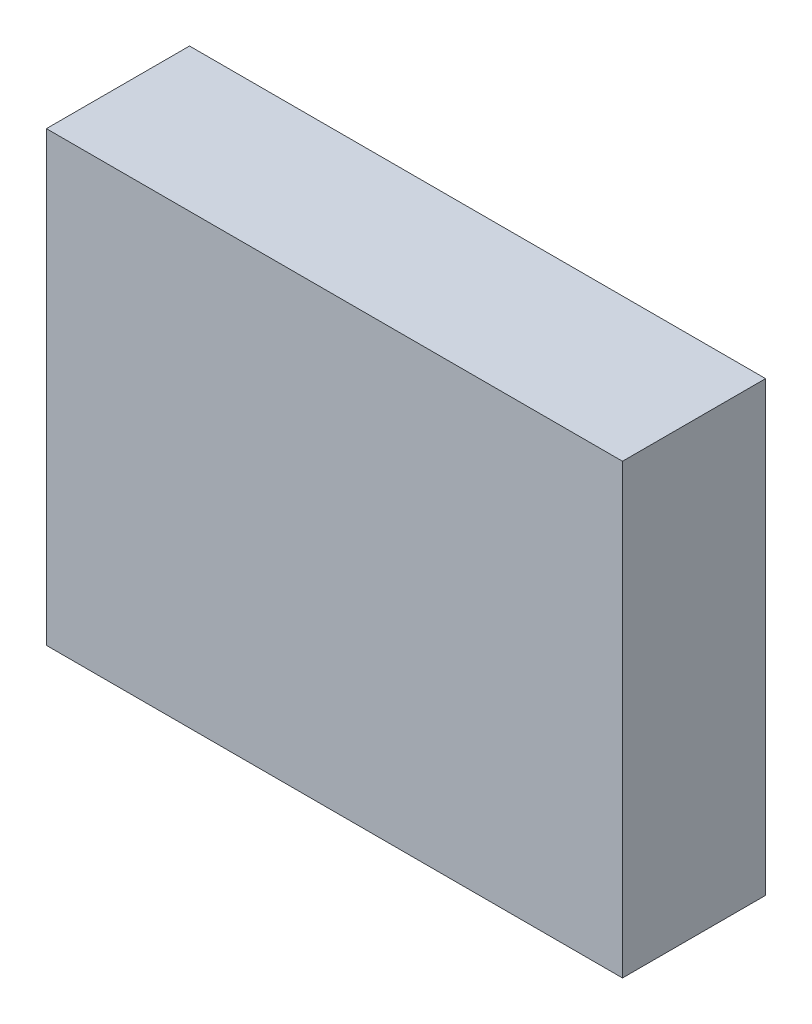
ISO-10303-21;
HEADER;
FILE_DESCRIPTION(('STEP AP214'),'2;1');
FILE_NAME('part.step','',(''),(''),'','','');
FILE_SCHEMA(('AUTOMOTIVE_DESIGN { 1 0 10303 214 1 1 1 1 }'));
ENDSEC;
DATA;
#1=APPLICATION_CONTEXT('core data for automotive mechanical design processes');
#2=APPLICATION_PROTOCOL_DEFINITION('international standard','automotive_design',2000,#1);
#3=PRODUCT_CONTEXT('',#1,'mechanical');
#4=PRODUCT('Part','Part','',(#3));
#5=PRODUCT_RELATED_PRODUCT_CATEGORY('part','',(#4));
#6=PRODUCT_DEFINITION_FORMATION('','',#4);
#7=PRODUCT_DEFINITION_CONTEXT('part definition',#1,'design');
#8=PRODUCT_DEFINITION('design','',#6,#7);
#9=PRODUCT_DEFINITION_SHAPE('','',#8);
#10=(LENGTH_UNIT() NAMED_UNIT(*) SI_UNIT(.MILLI.,.METRE.));
#11=(NAMED_UNIT(*) PLANE_ANGLE_UNIT() SI_UNIT($,.RADIAN.));
#12=(NAMED_UNIT(*) SI_UNIT($,.STERADIAN.) SOLID_ANGLE_UNIT());
#13=UNCERTAINTY_MEASURE_WITH_UNIT(LENGTH_MEASURE(1.E-05),#10,'distance_accuracy_value','');
#14=(GEOMETRIC_REPRESENTATION_CONTEXT(3) GLOBAL_UNCERTAINTY_ASSIGNED_CONTEXT((#13)) GLOBAL_UNIT_ASSIGNED_CONTEXT((#10,
#11,#12)) REPRESENTATION_CONTEXT('',''));
#15=CARTESIAN_POINT('',(0.,0.,0.));
#16=DIRECTION('',(0.,0.,1.));
#17=DIRECTION('',(1.,0.,0.));
#18=AXIS2_PLACEMENT_3D('',#15,#16,#17);
#19=CARTESIAN_POINT('',(1.400045,-0.99987,1.));
#20=DIRECTION('',(0.,0.,1.));
#21=DIRECTION('',(1.,0.,0.));
#22=AXIS2_PLACEMENT_3D('',#19,#20,#21);
#23=PLANE('',#22);
#24=DIRECTION('',(1.,0.,0.));
#25=VECTOR('',#24,1.);
#26=CARTESIAN_POINT('',(-0.61265,-2.56337,1.));
#27=LINE('',#26,#25);
#28=CARTESIAN_POINT('',(-0.61265,-2.56337,1.));
#29=VERTEX_POINT('',#28);
#30=CARTESIAN_POINT('',(3.41274,-2.56337,1.));
#31=VERTEX_POINT('',#30);
#32=EDGE_CURVE('E90',#29,#31,#27,.T.);
#33=ORIENTED_EDGE('',*,*,#32,.T.);
#34=DIRECTION('',(0.,1.,0.));
#35=VECTOR('',#34,1.);
#36=CARTESIAN_POINT('',(3.41274,-2.56337,1.));
#37=LINE('',#36,#35);
#38=CARTESIAN_POINT('',(3.41274,0.56363,1.));
#39=VERTEX_POINT('',#38);
#40=EDGE_CURVE('E75',#31,#39,#37,.T.);
#41=ORIENTED_EDGE('',*,*,#40,.T.);
#42=DIRECTION('',(-1.,0.,0.));
#43=VECTOR('',#42,1.);
#44=CARTESIAN_POINT('',(3.41274,0.56363,1.));
#45=LINE('',#44,#43);
#46=CARTESIAN_POINT('',(-0.61265,0.56363,1.));
#47=VERTEX_POINT('',#46);
#48=EDGE_CURVE('E80',#39,#47,#45,.T.);
#49=ORIENTED_EDGE('',*,*,#48,.T.);
#50=DIRECTION('',(0.,-1.,0.));
#51=VECTOR('',#50,1.);
#52=CARTESIAN_POINT('',(-0.61265,0.56363,1.));
#53=LINE('',#52,#51);
#54=EDGE_CURVE('E11',#47,#29,#53,.T.);
#55=ORIENTED_EDGE('',*,*,#54,.T.);
#56=EDGE_LOOP('',(#33,#41,#49,#55));
#57=FACE_BOUND('',#56,.T.);
#58=ADVANCED_FACE('F16',(#57),#23,.T.);
#59=CARTESIAN_POINT('',(1.400045,-0.99987,0.));
#60=DIRECTION('',(0.,0.,1.));
#61=DIRECTION('',(1.,0.,0.));
#62=AXIS2_PLACEMENT_3D('',#59,#60,#61);
#63=PLANE('',#62);
#64=DIRECTION('',(1.,0.,0.));
#65=VECTOR('',#64,1.);
#66=CARTESIAN_POINT('',(-0.61265,-2.56337,0.));
#67=LINE('',#66,#65);
#68=CARTESIAN_POINT('',(-0.61265,-2.56337,0.));
#69=VERTEX_POINT('',#68);
#70=CARTESIAN_POINT('',(3.41274,-2.56337,0.));
#71=VERTEX_POINT('',#70);
#72=EDGE_CURVE('E20',#69,#71,#67,.T.);
#73=ORIENTED_EDGE('',*,*,#72,.F.);
#74=DIRECTION('',(0.,-1.,0.));
#75=VECTOR('',#74,1.);
#76=CARTESIAN_POINT('',(-0.61265,0.56363,0.));
#77=LINE('',#76,#75);
#78=CARTESIAN_POINT('',(-0.61265,0.56363,0.));
#79=VERTEX_POINT('',#78);
#80=EDGE_CURVE('E27',#79,#69,#77,.T.);
#81=ORIENTED_EDGE('',*,*,#80,.F.);
#82=DIRECTION('',(-1.,0.,0.));
#83=VECTOR('',#82,1.);
#84=CARTESIAN_POINT('',(3.41274,0.56363,0.));
#85=LINE('',#84,#83);
#86=CARTESIAN_POINT('',(3.41274,0.56363,0.));
#87=VERTEX_POINT('',#86);
#88=EDGE_CURVE('E64',#87,#79,#85,.T.);
#89=ORIENTED_EDGE('',*,*,#88,.F.);
#90=DIRECTION('',(0.,1.,0.));
#91=VECTOR('',#90,1.);
#92=CARTESIAN_POINT('',(3.41274,-2.56337,0.));
#93=LINE('',#92,#91);
#94=EDGE_CURVE('E68',#71,#87,#93,.T.);
#95=ORIENTED_EDGE('',*,*,#94,.F.);
#96=EDGE_LOOP('',(#73,#81,#89,#95));
#97=FACE_BOUND('',#96,.T.);
#98=ADVANCED_FACE('F18',(#97),#63,.F.);
#99=CARTESIAN_POINT('',(-0.61265,0.56363,0.));
#100=DIRECTION('',(1.,0.,0.));
#101=DIRECTION('',(0.,1.,0.));
#102=AXIS2_PLACEMENT_3D('',#99,#100,#101);
#103=PLANE('',#102);
#104=DIRECTION('',(0.,0.,1.));
#105=VECTOR('',#104,1.);
#106=CARTESIAN_POINT('',(-0.61265,0.56363,0.));
#107=LINE('',#106,#105);
#108=EDGE_CURVE('E74',#79,#47,#107,.T.);
#109=ORIENTED_EDGE('',*,*,#108,.F.);
#110=ORIENTED_EDGE('',*,*,#80,.T.);
#111=DIRECTION('',(0.,0.,1.));
#112=VECTOR('',#111,1.);
#113=CARTESIAN_POINT('',(-0.61265,-2.56337,0.));
#114=LINE('',#113,#112);
#115=EDGE_CURVE('E100',#69,#29,#114,.T.);
#116=ORIENTED_EDGE('',*,*,#115,.T.);
#117=ORIENTED_EDGE('',*,*,#54,.F.);
#118=EDGE_LOOP('',(#109,#110,#116,#117));
#119=FACE_BOUND('',#118,.T.);
#120=ADVANCED_FACE('F106',(#119),#103,.F.);
#121=CARTESIAN_POINT('',(3.41274,0.56363,0.));
#122=DIRECTION('',(0.,-1.,0.));
#123=DIRECTION('',(0.,0.,-1.));
#124=AXIS2_PLACEMENT_3D('',#121,#122,#123);
#125=PLANE('',#124);
#126=DIRECTION('',(0.,0.,1.));
#127=VECTOR('',#126,1.);
#128=CARTESIAN_POINT('',(3.41274,0.56363,0.));
#129=LINE('',#128,#127);
#130=EDGE_CURVE('E78',#87,#39,#129,.T.);
#131=ORIENTED_EDGE('',*,*,#130,.F.);
#132=ORIENTED_EDGE('',*,*,#88,.T.);
#133=ORIENTED_EDGE('',*,*,#108,.T.);
#134=ORIENTED_EDGE('',*,*,#48,.F.);
#135=EDGE_LOOP('',(#131,#132,#133,#134));
#136=FACE_BOUND('',#135,.T.);
#137=ADVANCED_FACE('F79',(#136),#125,.F.);
#138=CARTESIAN_POINT('',(3.41274,-2.56337,0.));
#139=DIRECTION('',(-1.,0.,0.));
#140=DIRECTION('',(0.,0.,1.));
#141=AXIS2_PLACEMENT_3D('',#138,#139,#140);
#142=PLANE('',#141);
#143=DIRECTION('',(0.,0.,1.));
#144=VECTOR('',#143,1.);
#145=CARTESIAN_POINT('',(3.41274,-2.56337,0.));
#146=LINE('',#145,#144);
#147=EDGE_CURVE('E87',#71,#31,#146,.T.);
#148=ORIENTED_EDGE('',*,*,#147,.F.);
#149=ORIENTED_EDGE('',*,*,#94,.T.);
#150=ORIENTED_EDGE('',*,*,#130,.T.);
#151=ORIENTED_EDGE('',*,*,#40,.F.);
#152=EDGE_LOOP('',(#148,#149,#150,#151));
#153=FACE_BOUND('',#152,.T.);
#154=ADVANCED_FACE('F85',(#153),#142,.F.);
#155=CARTESIAN_POINT('',(-0.61265,-2.56337,0.));
#156=DIRECTION('',(0.,1.,0.));
#157=DIRECTION('',(1.,0.,0.));
#158=AXIS2_PLACEMENT_3D('',#155,#156,#157);
#159=PLANE('',#158);
#160=ORIENTED_EDGE('',*,*,#115,.F.);
#161=ORIENTED_EDGE('',*,*,#72,.T.);
#162=ORIENTED_EDGE('',*,*,#147,.T.);
#163=ORIENTED_EDGE('',*,*,#32,.F.);
#164=EDGE_LOOP('',(#160,#161,#162,#163));
#165=FACE_BOUND('',#164,.T.);
#166=ADVANCED_FACE('F111',(#165),#159,.F.);
#167=CLOSED_SHELL('',(#58,#98,#120,#137,#154,#166));
#168=MANIFOLD_SOLID_BREP('B1',#167);
#169=ADVANCED_BREP_SHAPE_REPRESENTATION('',(#18,#168),#14);
#170=SHAPE_DEFINITION_REPRESENTATION(#9,#169);
ENDSEC;
END-ISO-10303-21;
